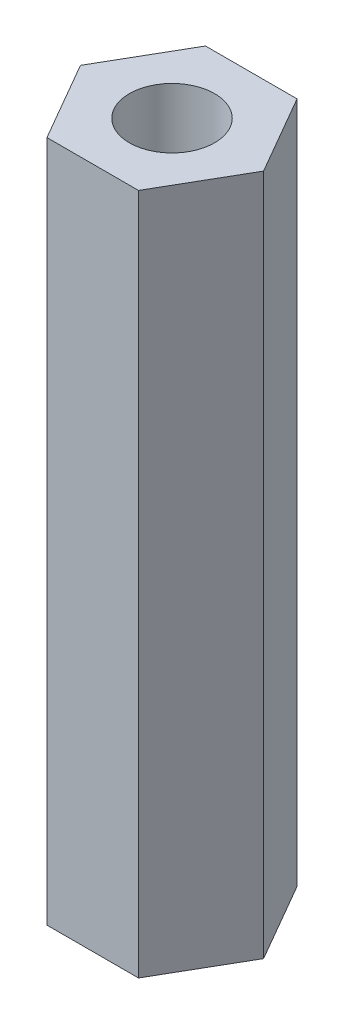
ISO-10303-21;
HEADER;
FILE_DESCRIPTION(('STEP AP214'),'2;1');
FILE_NAME('part.step','',(''),(''),'','','');
FILE_SCHEMA(('AUTOMOTIVE_DESIGN { 1 0 10303 214 1 1 1 1 }'));
ENDSEC;
DATA;
#1=APPLICATION_CONTEXT('core data for automotive mechanical design processes');
#2=APPLICATION_PROTOCOL_DEFINITION('international standard','automotive_design',2000,#1);
#3=PRODUCT_CONTEXT('',#1,'mechanical');
#4=PRODUCT('Part','Part','',(#3));
#5=PRODUCT_RELATED_PRODUCT_CATEGORY('part','',(#4));
#6=PRODUCT_DEFINITION_FORMATION('','',#4);
#7=PRODUCT_DEFINITION_CONTEXT('part definition',#1,'design');
#8=PRODUCT_DEFINITION('design','',#6,#7);
#9=PRODUCT_DEFINITION_SHAPE('','',#8);
#10=(LENGTH_UNIT() NAMED_UNIT(*) SI_UNIT(.MILLI.,.METRE.));
#11=(NAMED_UNIT(*) PLANE_ANGLE_UNIT() SI_UNIT($,.RADIAN.));
#12=(NAMED_UNIT(*) SI_UNIT($,.STERADIAN.) SOLID_ANGLE_UNIT());
#13=UNCERTAINTY_MEASURE_WITH_UNIT(LENGTH_MEASURE(1.E-05),#10,'distance_accuracy_value','');
#14=(GEOMETRIC_REPRESENTATION_CONTEXT(3) GLOBAL_UNCERTAINTY_ASSIGNED_CONTEXT((#13)) GLOBAL_UNIT_ASSIGNED_CONTEXT((#10,
#11,#12)) REPRESENTATION_CONTEXT('',''));
#15=CARTESIAN_POINT('',(0.,0.,0.));
#16=DIRECTION('',(0.,0.,1.));
#17=DIRECTION('',(1.,0.,0.));
#18=AXIS2_PLACEMENT_3D('',#15,#16,#17);
#19=CARTESIAN_POINT('',(1.34233937586591,10.,2.32499999999999));
#20=DIRECTION('',(-0.866025403784442,0.,-0.499999999999995));
#21=DIRECTION('',(-0.499999999999995,0.,0.866025403784442));
#22=AXIS2_PLACEMENT_3D('',#19,#20,#21);
#23=PLANE('',#22);
#24=DIRECTION('',(0.499999999999995,0.,-0.866025403784442));
#25=VECTOR('',#24,1.);
#26=CARTESIAN_POINT('',(1.34233937586591,-10.,2.32499999999999));
#27=LINE('',#26,#25);
#28=CARTESIAN_POINT('',(1.34233937586591,-10.,2.32499999999999));
#29=VERTEX_POINT('',#28);
#30=CARTESIAN_POINT('',(2.68467875173176,-10.,0.));
#31=VERTEX_POINT('',#30);
#32=EDGE_CURVE('E125',#29,#31,#27,.T.);
#33=ORIENTED_EDGE('',*,*,#32,.T.);
#34=DIRECTION('',(0.,-1.,0.));
#35=VECTOR('',#34,1.);
#36=CARTESIAN_POINT('',(2.68467875173176,10.,0.));
#37=LINE('',#36,#35);
#38=CARTESIAN_POINT('',(2.68467875173176,10.,0.));
#39=VERTEX_POINT('',#38);
#40=EDGE_CURVE('E11',#39,#31,#37,.T.);
#41=ORIENTED_EDGE('',*,*,#40,.F.);
#42=DIRECTION('',(0.499999999999995,0.,-0.866025403784442));
#43=VECTOR('',#42,1.);
#44=CARTESIAN_POINT('',(1.34233937586591,10.,2.32499999999999));
#45=LINE('',#44,#43);
#46=CARTESIAN_POINT('',(1.34233937586591,10.,2.32499999999999));
#47=VERTEX_POINT('',#46);
#48=EDGE_CURVE('E136',#47,#39,#45,.T.);
#49=ORIENTED_EDGE('',*,*,#48,.F.);
#50=DIRECTION('',(0.,-1.,0.));
#51=VECTOR('',#50,1.);
#52=CARTESIAN_POINT('',(1.34233937586591,10.,2.32499999999999));
#53=LINE('',#52,#51);
#54=EDGE_CURVE('E121',#47,#29,#53,.T.);
#55=ORIENTED_EDGE('',*,*,#54,.T.);
#56=EDGE_LOOP('',(#33,#41,#49,#55));
#57=FACE_BOUND('',#56,.T.);
#58=ADVANCED_FACE('F38',(#57),#23,.F.);
#59=CARTESIAN_POINT('',(2.68467875173176,10.,0.));
#60=DIRECTION('',(-0.866025403784438,0.,0.500000000000001));
#61=DIRECTION('',(0.500000000000001,0.,0.866025403784438));
#62=AXIS2_PLACEMENT_3D('',#59,#60,#61);
#63=PLANE('',#62);
#64=DIRECTION('',(-0.500000000000001,0.,-0.866025403784438));
#65=VECTOR('',#64,1.);
#66=CARTESIAN_POINT('',(2.68467875173176,-10.,0.));
#67=LINE('',#66,#65);
#68=CARTESIAN_POINT('',(1.34233937586588,-10.,-2.325));
#69=VERTEX_POINT('',#68);
#70=EDGE_CURVE('E128',#31,#69,#67,.T.);
#71=ORIENTED_EDGE('',*,*,#70,.T.);
#72=DIRECTION('',(0.,-1.,0.));
#73=VECTOR('',#72,1.);
#74=CARTESIAN_POINT('',(1.34233937586588,10.,-2.325));
#75=LINE('',#74,#73);
#76=CARTESIAN_POINT('',(1.34233937586588,10.,-2.325));
#77=VERTEX_POINT('',#76);
#78=EDGE_CURVE('E46',#77,#69,#75,.T.);
#79=ORIENTED_EDGE('',*,*,#78,.F.);
#80=DIRECTION('',(-0.500000000000001,0.,-0.866025403784438));
#81=VECTOR('',#80,1.);
#82=CARTESIAN_POINT('',(2.68467875173176,10.,0.));
#83=LINE('',#82,#81);
#84=EDGE_CURVE('E92',#39,#77,#83,.T.);
#85=ORIENTED_EDGE('',*,*,#84,.F.);
#86=ORIENTED_EDGE('',*,*,#40,.T.);
#87=EDGE_LOOP('',(#71,#79,#85,#86));
#88=FACE_BOUND('',#87,.T.);
#89=ADVANCED_FACE('F161',(#88),#63,.F.);
#90=CARTESIAN_POINT('',(1.34233937586588,10.,-2.325));
#91=DIRECTION('',(0.,0.,1.));
#92=DIRECTION('',(1.,0.,0.));
#93=AXIS2_PLACEMENT_3D('',#90,#91,#92);
#94=PLANE('',#93);
#95=DIRECTION('',(-1.,0.,0.));
#96=VECTOR('',#95,1.);
#97=CARTESIAN_POINT('',(1.34233937586588,-10.,-2.325));
#98=LINE('',#97,#96);
#99=CARTESIAN_POINT('',(-1.34233937586589,-10.,-2.32499999999999));
#100=VERTEX_POINT('',#99);
#101=EDGE_CURVE('E131',#69,#100,#98,.T.);
#102=ORIENTED_EDGE('',*,*,#101,.T.);
#103=DIRECTION('',(0.,-1.,0.));
#104=VECTOR('',#103,1.);
#105=CARTESIAN_POINT('',(-1.34233937586589,10.,-2.32499999999999));
#106=LINE('',#105,#104);
#107=CARTESIAN_POINT('',(-1.34233937586589,10.,-2.32499999999999));
#108=VERTEX_POINT('',#107);
#109=EDGE_CURVE('E116',#108,#100,#106,.T.);
#110=ORIENTED_EDGE('',*,*,#109,.F.);
#111=DIRECTION('',(-1.,0.,0.));
#112=VECTOR('',#111,1.);
#113=CARTESIAN_POINT('',(1.34233937586588,10.,-2.325));
#114=LINE('',#113,#112);
#115=EDGE_CURVE('E107',#77,#108,#114,.T.);
#116=ORIENTED_EDGE('',*,*,#115,.F.);
#117=ORIENTED_EDGE('',*,*,#78,.T.);
#118=EDGE_LOOP('',(#102,#110,#116,#117));
#119=FACE_BOUND('',#118,.T.);
#120=ADVANCED_FACE('F142',(#119),#94,.F.);
#121=CARTESIAN_POINT('',(-1.34233937586589,10.,-2.32499999999999));
#122=DIRECTION('',(0.866025403784441,0.,0.499999999999995));
#123=DIRECTION('',(0.499999999999995,0.,-0.866025403784441));
#124=AXIS2_PLACEMENT_3D('',#121,#122,#123);
#125=PLANE('',#124);
#126=DIRECTION('',(-0.499999999999995,0.,0.866025403784441));
#127=VECTOR('',#126,1.);
#128=CARTESIAN_POINT('',(-1.34233937586589,-10.,-2.32499999999999));
#129=LINE('',#128,#127);
#130=CARTESIAN_POINT('',(-2.68467875173176,-10.,0.));
#131=VERTEX_POINT('',#130);
#132=EDGE_CURVE('E115',#100,#131,#129,.T.);
#133=ORIENTED_EDGE('',*,*,#132,.T.);
#134=DIRECTION('',(0.,-1.,0.));
#135=VECTOR('',#134,1.);
#136=CARTESIAN_POINT('',(-2.68467875173176,10.,0.));
#137=LINE('',#136,#135);
#138=CARTESIAN_POINT('',(-2.68467875173176,10.,0.));
#139=VERTEX_POINT('',#138);
#140=EDGE_CURVE('E112',#139,#131,#137,.T.);
#141=ORIENTED_EDGE('',*,*,#140,.F.);
#142=DIRECTION('',(-0.499999999999995,0.,0.866025403784441));
#143=VECTOR('',#142,1.);
#144=CARTESIAN_POINT('',(-1.34233937586589,10.,-2.32499999999999));
#145=LINE('',#144,#143);
#146=EDGE_CURVE('E101',#108,#139,#145,.T.);
#147=ORIENTED_EDGE('',*,*,#146,.F.);
#148=ORIENTED_EDGE('',*,*,#109,.T.);
#149=EDGE_LOOP('',(#133,#141,#147,#148));
#150=FACE_BOUND('',#149,.T.);
#151=ADVANCED_FACE('F113',(#150),#125,.F.);
#152=CARTESIAN_POINT('',(-2.68467875173176,10.,0.));
#153=DIRECTION('',(0.866025403784434,0.,-0.500000000000007));
#154=DIRECTION('',(-0.500000000000007,0.,-0.866025403784435));
#155=AXIS2_PLACEMENT_3D('',#152,#153,#154);
#156=PLANE('',#155);
#157=DIRECTION('',(0.500000000000007,0.,0.866025403784434));
#158=VECTOR('',#157,1.);
#159=CARTESIAN_POINT('',(-2.68467875173176,-10.,0.));
#160=LINE('',#159,#158);
#161=CARTESIAN_POINT('',(-1.34233937586586,-10.,2.32500000000001));
#162=VERTEX_POINT('',#161);
#163=EDGE_CURVE('E78',#131,#162,#160,.T.);
#164=ORIENTED_EDGE('',*,*,#163,.T.);
#165=DIRECTION('',(0.,-1.,0.));
#166=VECTOR('',#165,1.);
#167=CARTESIAN_POINT('',(-1.34233937586586,10.,2.32500000000001));
#168=LINE('',#167,#166);
#169=CARTESIAN_POINT('',(-1.34233937586586,10.,2.32500000000001));
#170=VERTEX_POINT('',#169);
#171=EDGE_CURVE('E117',#170,#162,#168,.T.);
#172=ORIENTED_EDGE('',*,*,#171,.F.);
#173=DIRECTION('',(0.500000000000007,0.,0.866025403784434));
#174=VECTOR('',#173,1.);
#175=CARTESIAN_POINT('',(-2.68467875173176,10.,0.));
#176=LINE('',#175,#174);
#177=EDGE_CURVE('E105',#139,#170,#176,.T.);
#178=ORIENTED_EDGE('',*,*,#177,.F.);
#179=ORIENTED_EDGE('',*,*,#140,.T.);
#180=EDGE_LOOP('',(#164,#172,#178,#179));
#181=FACE_BOUND('',#180,.T.);
#182=ADVANCED_FACE('F119',(#181),#156,.F.);
#183=CARTESIAN_POINT('',(-1.34233937586586,10.,2.32500000000001));
#184=DIRECTION('',(0.,0.,-1.));
#185=DIRECTION('',(-1.,0.,0.));
#186=AXIS2_PLACEMENT_3D('',#183,#184,#185);
#187=PLANE('',#186);
#188=DIRECTION('',(1.,0.,0.));
#189=VECTOR('',#188,1.);
#190=CARTESIAN_POINT('',(-1.34233937586586,-10.,2.32500000000001));
#191=LINE('',#190,#189);
#192=EDGE_CURVE('E84',#162,#29,#191,.T.);
#193=ORIENTED_EDGE('',*,*,#192,.T.);
#194=ORIENTED_EDGE('',*,*,#54,.F.);
#195=DIRECTION('',(1.,0.,0.));
#196=VECTOR('',#195,1.);
#197=CARTESIAN_POINT('',(-1.34233937586586,10.,2.32500000000001));
#198=LINE('',#197,#196);
#199=EDGE_CURVE('E54',#170,#47,#198,.T.);
#200=ORIENTED_EDGE('',*,*,#199,.F.);
#201=ORIENTED_EDGE('',*,*,#171,.T.);
#202=EDGE_LOOP('',(#193,#194,#200,#201));
#203=FACE_BOUND('',#202,.T.);
#204=ADVANCED_FACE('F149',(#203),#187,.F.);
#205=CARTESIAN_POINT('',(0.,10.,0.));
#206=DIRECTION('',(0.,1.,0.));
#207=DIRECTION('',(0.,0.,1.));
#208=AXIS2_PLACEMENT_3D('',#205,#206,#207);
#209=PLANE('',#208);
#210=CARTESIAN_POINT('',(0.,10.,0.));
#211=DIRECTION('',(0.,1.,0.));
#212=DIRECTION('',(0.,0.,1.));
#213=AXIS2_PLACEMENT_3D('',#210,#211,#212);
#214=CIRCLE('',#213,1.24999999999999);
#215=CARTESIAN_POINT('',(0.,10.,1.24999999999999));
#216=VERTEX_POINT('',#215);
#217=EDGE_CURVE('E255',#216,#216,#214,.T.);
#218=ORIENTED_EDGE('',*,*,#217,.F.);
#219=EDGE_LOOP('',(#218));
#220=FACE_BOUND('',#219,.T.);
#221=ORIENTED_EDGE('',*,*,#48,.T.);
#222=ORIENTED_EDGE('',*,*,#84,.T.);
#223=ORIENTED_EDGE('',*,*,#115,.T.);
#224=ORIENTED_EDGE('',*,*,#146,.T.);
#225=ORIENTED_EDGE('',*,*,#177,.T.);
#226=ORIENTED_EDGE('',*,*,#199,.T.);
#227=EDGE_LOOP('',(#221,#222,#223,#224,#225,#226));
#228=FACE_BOUND('',#227,.T.);
#229=ADVANCED_FACE('F103',(#220,#228),#209,.T.);
#230=CARTESIAN_POINT('',(0.,-10.,0.));
#231=DIRECTION('',(0.,1.,0.));
#232=DIRECTION('',(0.,0.,1.));
#233=AXIS2_PLACEMENT_3D('',#230,#231,#232);
#234=PLANE('',#233);
#235=CARTESIAN_POINT('',(0.,-10.,0.));
#236=DIRECTION('',(0.,-1.,0.));
#237=DIRECTION('',(0.,0.,-1.));
#238=AXIS2_PLACEMENT_3D('',#235,#236,#237);
#239=CIRCLE('',#238,1.24999999999999);
#240=CARTESIAN_POINT('',(0.,-10.,-1.24999999999999));
#241=VERTEX_POINT('',#240);
#242=EDGE_CURVE('E257',#241,#241,#239,.T.);
#243=ORIENTED_EDGE('',*,*,#242,.F.);
#244=EDGE_LOOP('',(#243));
#245=FACE_BOUND('',#244,.T.);
#246=ORIENTED_EDGE('',*,*,#32,.F.);
#247=ORIENTED_EDGE('',*,*,#192,.F.);
#248=ORIENTED_EDGE('',*,*,#163,.F.);
#249=ORIENTED_EDGE('',*,*,#132,.F.);
#250=ORIENTED_EDGE('',*,*,#101,.F.);
#251=ORIENTED_EDGE('',*,*,#70,.F.);
#252=EDGE_LOOP('',(#246,#247,#248,#249,#250,#251));
#253=FACE_BOUND('',#252,.T.);
#254=ADVANCED_FACE('F145',(#245,#253),#234,.F.);
#255=CARTESIAN_POINT('',(0.,-2.5,0.));
#256=DIRECTION('',(0.,-1.,0.));
#257=DIRECTION('',(0.,0.,-1.));
#258=AXIS2_PLACEMENT_3D('',#255,#256,#257);
#259=CONICAL_SURFACE('',#258,1.25,1.02974425867665);
#260=CARTESIAN_POINT('',(0.,-1.74892422621555,0.));
#261=VERTEX_POINT('',#260);
#262=VERTEX_LOOP('',#261);
#263=FACE_BOUND('',#262,.T.);
#264=CARTESIAN_POINT('',(0.,-2.5,0.));
#265=DIRECTION('',(0.,-1.,0.));
#266=DIRECTION('',(0.,0.,-1.));
#267=AXIS2_PLACEMENT_3D('',#264,#265,#266);
#268=CIRCLE('',#267,1.25);
#269=CARTESIAN_POINT('',(0.,-2.5,-1.25));
#270=VERTEX_POINT('',#269);
#271=EDGE_CURVE('E129',#270,#270,#268,.T.);
#272=ORIENTED_EDGE('',*,*,#271,.T.);
#273=EDGE_LOOP('',(#272));
#274=FACE_BOUND('',#273,.T.);
#275=ADVANCED_FACE('F193',(#263,#274),#259,.F.);
#276=CARTESIAN_POINT('',(0.,-10.,0.));
#277=DIRECTION('',(0.,-1.,0.));
#278=DIRECTION('',(0.,0.,-1.));
#279=AXIS2_PLACEMENT_3D('',#276,#277,#278);
#280=CYLINDRICAL_SURFACE('',#279,1.24999999999999);
#281=ORIENTED_EDGE('',*,*,#271,.F.);
#282=EDGE_LOOP('',(#281));
#283=FACE_BOUND('',#282,.T.);
#284=ORIENTED_EDGE('',*,*,#242,.T.);
#285=EDGE_LOOP('',(#284));
#286=FACE_BOUND('',#285,.T.);
#287=ADVANCED_FACE('F202',(#283,#286),#280,.F.);
#288=CARTESIAN_POINT('',(0.,2.5,0.));
#289=DIRECTION('',(0.,1.,0.));
#290=DIRECTION('',(0.,0.,1.));
#291=AXIS2_PLACEMENT_3D('',#288,#289,#290);
#292=CONICAL_SURFACE('',#291,1.25,1.02974425867665);
#293=CARTESIAN_POINT('',(0.,1.74892422621555,0.));
#294=VERTEX_POINT('',#293);
#295=VERTEX_LOOP('',#294);
#296=FACE_BOUND('',#295,.T.);
#297=CARTESIAN_POINT('',(0.,2.5,0.));
#298=DIRECTION('',(0.,1.,0.));
#299=DIRECTION('',(0.,0.,1.));
#300=AXIS2_PLACEMENT_3D('',#297,#298,#299);
#301=CIRCLE('',#300,1.25);
#302=CARTESIAN_POINT('',(0.,2.5,1.25));
#303=VERTEX_POINT('',#302);
#304=EDGE_CURVE('E252',#303,#303,#301,.T.);
#305=ORIENTED_EDGE('',*,*,#304,.T.);
#306=EDGE_LOOP('',(#305));
#307=FACE_BOUND('',#306,.T.);
#308=ADVANCED_FACE('F213',(#296,#307),#292,.F.);
#309=CARTESIAN_POINT('',(0.,10.,0.));
#310=DIRECTION('',(0.,1.,0.));
#311=DIRECTION('',(0.,0.,1.));
#312=AXIS2_PLACEMENT_3D('',#309,#310,#311);
#313=CYLINDRICAL_SURFACE('',#312,1.24999999999999);
#314=ORIENTED_EDGE('',*,*,#304,.F.);
#315=EDGE_LOOP('',(#314));
#316=FACE_BOUND('',#315,.T.);
#317=ORIENTED_EDGE('',*,*,#217,.T.);
#318=EDGE_LOOP('',(#317));
#319=FACE_BOUND('',#318,.T.);
#320=ADVANCED_FACE('F230',(#316,#319),#313,.F.);
#321=CLOSED_SHELL('',(#58,#89,#120,#151,#182,#204,#229,#254,#275,#287,#308,#320));
#322=MANIFOLD_SOLID_BREP('B2',#321);
#323=ADVANCED_BREP_SHAPE_REPRESENTATION('',(#18,#322),#14);
#324=SHAPE_DEFINITION_REPRESENTATION(#9,#323);
ENDSEC;
END-ISO-10303-21;
